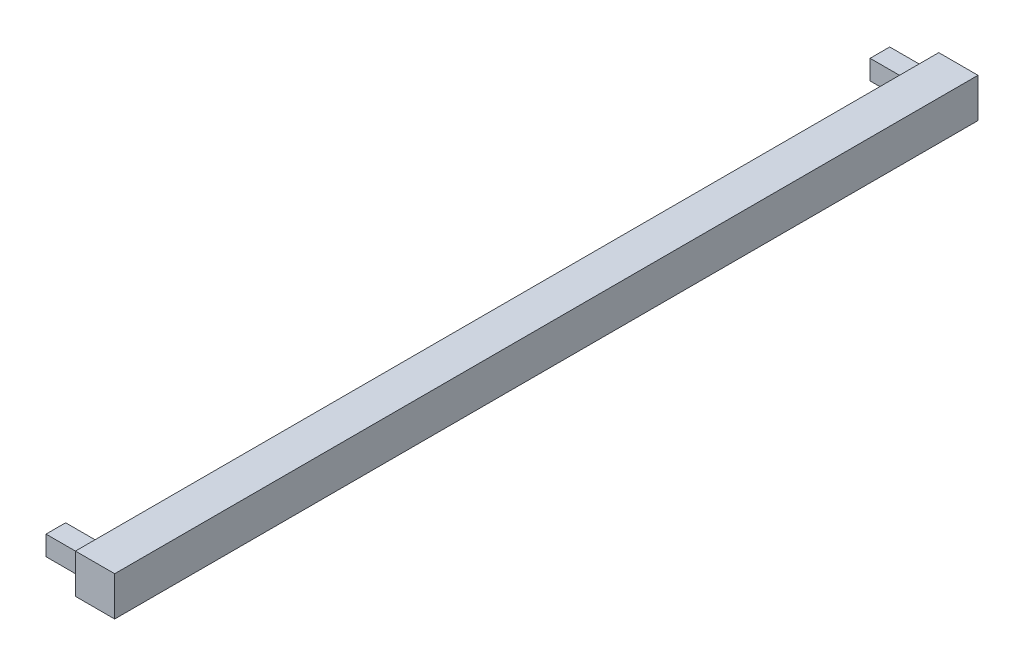
ISO-10303-21;
HEADER;
FILE_DESCRIPTION(('STEP AP214'),'2;1');
FILE_NAME('part.step','',(''),(''),'','','');
FILE_SCHEMA(('AUTOMOTIVE_DESIGN { 1 0 10303 214 1 1 1 1 }'));
ENDSEC;
DATA;
#1=APPLICATION_CONTEXT('core data for automotive mechanical design processes');
#2=APPLICATION_PROTOCOL_DEFINITION('international standard','automotive_design',2000,#1);
#3=PRODUCT_CONTEXT('',#1,'mechanical');
#4=PRODUCT('Part','Part','',(#3));
#5=PRODUCT_RELATED_PRODUCT_CATEGORY('part','',(#4));
#6=PRODUCT_DEFINITION_FORMATION('','',#4);
#7=PRODUCT_DEFINITION_CONTEXT('part definition',#1,'design');
#8=PRODUCT_DEFINITION('design','',#6,#7);
#9=PRODUCT_DEFINITION_SHAPE('','',#8);
#10=(LENGTH_UNIT() NAMED_UNIT(*) SI_UNIT(.MILLI.,.METRE.));
#11=(NAMED_UNIT(*) PLANE_ANGLE_UNIT() SI_UNIT($,.RADIAN.));
#12=(NAMED_UNIT(*) SI_UNIT($,.STERADIAN.) SOLID_ANGLE_UNIT());
#13=UNCERTAINTY_MEASURE_WITH_UNIT(LENGTH_MEASURE(1.E-05),#10,'distance_accuracy_value','');
#14=(GEOMETRIC_REPRESENTATION_CONTEXT(3) GLOBAL_UNCERTAINTY_ASSIGNED_CONTEXT((#13)) GLOBAL_UNIT_ASSIGNED_CONTEXT((#10,
#11,#12)) REPRESENTATION_CONTEXT('',''));
#15=CARTESIAN_POINT('',(0.,0.,0.));
#16=DIRECTION('',(0.,0.,1.));
#17=DIRECTION('',(1.,0.,0.));
#18=AXIS2_PLACEMENT_3D('',#15,#16,#17);
#19=CARTESIAN_POINT('',(0.,0.,110.));
#20=DIRECTION('',(1.,0.,0.));
#21=DIRECTION('',(0.,0.,-1.));
#22=AXIS2_PLACEMENT_3D('',#19,#20,#21);
#23=PLANE('',#22);
#24=DIRECTION('',(0.,-1.,0.));
#25=VECTOR('',#24,1.);
#26=CARTESIAN_POINT('',(0.,1.25,1.25));
#27=LINE('',#26,#25);
#28=CARTESIAN_POINT('',(0.,3.75,1.25));
#29=VERTEX_POINT('',#28);
#30=CARTESIAN_POINT('',(0.,1.25,1.25));
#31=VERTEX_POINT('',#30);
#32=EDGE_CURVE('E142',#29,#31,#27,.T.);
#33=ORIENTED_EDGE('',*,*,#32,.F.);
#34=DIRECTION('',(0.,0.,-1.));
#35=VECTOR('',#34,1.);
#36=CARTESIAN_POINT('',(0.,3.75,1.25));
#37=LINE('',#36,#35);
#38=CARTESIAN_POINT('',(0.,3.75,3.75));
#39=VERTEX_POINT('',#38);
#40=EDGE_CURVE('E155',#39,#29,#37,.T.);
#41=ORIENTED_EDGE('',*,*,#40,.F.);
#42=DIRECTION('',(0.,1.,0.));
#43=VECTOR('',#42,1.);
#44=CARTESIAN_POINT('',(0.,1.25,3.75));
#45=LINE('',#44,#43);
#46=CARTESIAN_POINT('',(0.,1.25,3.75));
#47=VERTEX_POINT('',#46);
#48=EDGE_CURVE('E164',#47,#39,#45,.T.);
#49=ORIENTED_EDGE('',*,*,#48,.F.);
#50=DIRECTION('',(0.,0.,1.));
#51=VECTOR('',#50,1.);
#52=CARTESIAN_POINT('',(0.,1.25,1.25));
#53=LINE('',#52,#51);
#54=EDGE_CURVE('E145',#31,#47,#53,.T.);
#55=ORIENTED_EDGE('',*,*,#54,.F.);
#56=EDGE_LOOP('',(#33,#41,#49,#55));
#57=FACE_BOUND('',#56,.T.);
#58=DIRECTION('',(0.,-1.,0.));
#59=VECTOR('',#58,1.);
#60=CARTESIAN_POINT('',(0.,0.,0.));
#61=LINE('',#60,#59);
#62=CARTESIAN_POINT('',(0.,5.,0.));
#63=VERTEX_POINT('',#62);
#64=CARTESIAN_POINT('',(0.,0.,0.));
#65=VERTEX_POINT('',#64);
#66=EDGE_CURVE('E180',#63,#65,#61,.T.);
#67=ORIENTED_EDGE('',*,*,#66,.T.);
#68=DIRECTION('',(0.,0.,-1.));
#69=VECTOR('',#68,1.);
#70=CARTESIAN_POINT('',(0.,0.,110.));
#71=LINE('',#70,#69);
#72=CARTESIAN_POINT('',(0.,0.,110.));
#73=VERTEX_POINT('',#72);
#74=EDGE_CURVE('E11',#73,#65,#71,.T.);
#75=ORIENTED_EDGE('',*,*,#74,.F.);
#76=DIRECTION('',(0.,-1.,0.));
#77=VECTOR('',#76,1.);
#78=CARTESIAN_POINT('',(0.,0.,110.));
#79=LINE('',#78,#77);
#80=CARTESIAN_POINT('',(0.,5.,110.));
#81=VERTEX_POINT('',#80);
#82=EDGE_CURVE('E181',#81,#73,#79,.T.);
#83=ORIENTED_EDGE('',*,*,#82,.F.);
#84=DIRECTION('',(0.,0.,-1.));
#85=VECTOR('',#84,1.);
#86=CARTESIAN_POINT('',(0.,5.,110.));
#87=LINE('',#86,#85);
#88=EDGE_CURVE('E191',#81,#63,#87,.T.);
#89=ORIENTED_EDGE('',*,*,#88,.T.);
#90=EDGE_LOOP('',(#67,#75,#83,#89));
#91=FACE_BOUND('',#90,.T.);
#92=DIRECTION('',(0.,1.,0.));
#93=VECTOR('',#92,1.);
#94=CARTESIAN_POINT('',(0.,3.75,108.75));
#95=LINE('',#94,#93);
#96=CARTESIAN_POINT('',(0.,1.25,108.75));
#97=VERTEX_POINT('',#96);
#98=CARTESIAN_POINT('',(0.,3.75,108.75));
#99=VERTEX_POINT('',#98);
#100=EDGE_CURVE('E141',#97,#99,#95,.T.);
#101=ORIENTED_EDGE('',*,*,#100,.F.);
#102=DIRECTION('',(0.,0.,1.));
#103=VECTOR('',#102,1.);
#104=CARTESIAN_POINT('',(0.,1.25,108.75));
#105=LINE('',#104,#103);
#106=CARTESIAN_POINT('',(0.,1.25,106.25));
#107=VERTEX_POINT('',#106);
#108=EDGE_CURVE('E138',#107,#97,#105,.T.);
#109=ORIENTED_EDGE('',*,*,#108,.F.);
#110=DIRECTION('',(0.,-1.,0.));
#111=VECTOR('',#110,1.);
#112=CARTESIAN_POINT('',(0.,3.75,106.25));
#113=LINE('',#112,#111);
#114=CARTESIAN_POINT('',(0.,3.75,106.25));
#115=VERTEX_POINT('',#114);
#116=EDGE_CURVE('E52',#115,#107,#113,.T.);
#117=ORIENTED_EDGE('',*,*,#116,.F.);
#118=DIRECTION('',(0.,0.,-1.));
#119=VECTOR('',#118,1.);
#120=CARTESIAN_POINT('',(0.,3.75,108.75));
#121=LINE('',#120,#119);
#122=EDGE_CURVE('E47',#99,#115,#121,.T.);
#123=ORIENTED_EDGE('',*,*,#122,.F.);
#124=EDGE_LOOP('',(#101,#109,#117,#123));
#125=FACE_BOUND('',#124,.T.);
#126=ADVANCED_FACE('F33',(#57,#91,#125),#23,.F.);
#127=CARTESIAN_POINT('',(0.,0.,110.));
#128=DIRECTION('',(0.,1.,0.));
#129=DIRECTION('',(0.,0.,1.));
#130=AXIS2_PLACEMENT_3D('',#127,#128,#129);
#131=PLANE('',#130);
#132=DIRECTION('',(1.,0.,0.));
#133=VECTOR('',#132,1.);
#134=CARTESIAN_POINT('',(0.,0.,0.));
#135=LINE('',#134,#133);
#136=CARTESIAN_POINT('',(5.,0.,0.));
#137=VERTEX_POINT('',#136);
#138=EDGE_CURVE('E194',#65,#137,#135,.T.);
#139=ORIENTED_EDGE('',*,*,#138,.T.);
#140=DIRECTION('',(0.,0.,-1.));
#141=VECTOR('',#140,1.);
#142=CARTESIAN_POINT('',(5.,0.,110.));
#143=LINE('',#142,#141);
#144=CARTESIAN_POINT('',(5.,0.,110.));
#145=VERTEX_POINT('',#144);
#146=EDGE_CURVE('E40',#145,#137,#143,.T.);
#147=ORIENTED_EDGE('',*,*,#146,.F.);
#148=DIRECTION('',(1.,0.,0.));
#149=VECTOR('',#148,1.);
#150=CARTESIAN_POINT('',(0.,0.,110.));
#151=LINE('',#150,#149);
#152=EDGE_CURVE('E184',#73,#145,#151,.T.);
#153=ORIENTED_EDGE('',*,*,#152,.F.);
#154=ORIENTED_EDGE('',*,*,#74,.T.);
#155=EDGE_LOOP('',(#139,#147,#153,#154));
#156=FACE_BOUND('',#155,.T.);
#157=ADVANCED_FACE('F224',(#156),#131,.F.);
#158=CARTESIAN_POINT('',(5.,0.,110.));
#159=DIRECTION('',(-1.,0.,0.));
#160=DIRECTION('',(0.,0.,1.));
#161=AXIS2_PLACEMENT_3D('',#158,#159,#160);
#162=PLANE('',#161);
#163=DIRECTION('',(0.,1.,0.));
#164=VECTOR('',#163,1.);
#165=CARTESIAN_POINT('',(5.,0.,0.));
#166=LINE('',#165,#164);
#167=CARTESIAN_POINT('',(5.,5.,0.));
#168=VERTEX_POINT('',#167);
#169=EDGE_CURVE('E196',#137,#168,#166,.T.);
#170=ORIENTED_EDGE('',*,*,#169,.T.);
#171=DIRECTION('',(0.,0.,-1.));
#172=VECTOR('',#171,1.);
#173=CARTESIAN_POINT('',(5.,5.,110.));
#174=LINE('',#173,#172);
#175=CARTESIAN_POINT('',(5.,5.,110.));
#176=VERTEX_POINT('',#175);
#177=EDGE_CURVE('E201',#176,#168,#174,.T.);
#178=ORIENTED_EDGE('',*,*,#177,.F.);
#179=DIRECTION('',(0.,1.,0.));
#180=VECTOR('',#179,1.);
#181=CARTESIAN_POINT('',(5.,0.,110.));
#182=LINE('',#181,#180);
#183=EDGE_CURVE('E187',#145,#176,#182,.T.);
#184=ORIENTED_EDGE('',*,*,#183,.F.);
#185=ORIENTED_EDGE('',*,*,#146,.T.);
#186=EDGE_LOOP('',(#170,#178,#184,#185));
#187=FACE_BOUND('',#186,.T.);
#188=ADVANCED_FACE('F208',(#187),#162,.F.);
#189=CARTESIAN_POINT('',(0.,5.,110.));
#190=DIRECTION('',(0.,-1.,0.));
#191=DIRECTION('',(0.,0.,-1.));
#192=AXIS2_PLACEMENT_3D('',#189,#190,#191);
#193=PLANE('',#192);
#194=DIRECTION('',(-1.,0.,0.));
#195=VECTOR('',#194,1.);
#196=CARTESIAN_POINT('',(0.,5.,0.));
#197=LINE('',#196,#195);
#198=EDGE_CURVE('E185',#168,#63,#197,.T.);
#199=ORIENTED_EDGE('',*,*,#198,.T.);
#200=ORIENTED_EDGE('',*,*,#88,.F.);
#201=DIRECTION('',(-1.,0.,0.));
#202=VECTOR('',#201,1.);
#203=CARTESIAN_POINT('',(0.,5.,110.));
#204=LINE('',#203,#202);
#205=EDGE_CURVE('E189',#176,#81,#204,.T.);
#206=ORIENTED_EDGE('',*,*,#205,.F.);
#207=ORIENTED_EDGE('',*,*,#177,.T.);
#208=EDGE_LOOP('',(#199,#200,#206,#207));
#209=FACE_BOUND('',#208,.T.);
#210=ADVANCED_FACE('F217',(#209),#193,.F.);
#211=CARTESIAN_POINT('',(0.,0.,110.));
#212=DIRECTION('',(0.,0.,-1.));
#213=DIRECTION('',(-1.,0.,0.));
#214=AXIS2_PLACEMENT_3D('',#211,#212,#213);
#215=PLANE('',#214);
#216=ORIENTED_EDGE('',*,*,#82,.T.);
#217=ORIENTED_EDGE('',*,*,#152,.T.);
#218=ORIENTED_EDGE('',*,*,#183,.T.);
#219=ORIENTED_EDGE('',*,*,#205,.T.);
#220=EDGE_LOOP('',(#216,#217,#218,#219));
#221=FACE_BOUND('',#220,.T.);
#222=ADVANCED_FACE('F223',(#221),#215,.F.);
#223=CARTESIAN_POINT('',(0.,0.,0.));
#224=DIRECTION('',(0.,0.,-1.));
#225=DIRECTION('',(-1.,0.,0.));
#226=AXIS2_PLACEMENT_3D('',#223,#224,#225);
#227=PLANE('',#226);
#228=ORIENTED_EDGE('',*,*,#66,.F.);
#229=ORIENTED_EDGE('',*,*,#198,.F.);
#230=ORIENTED_EDGE('',*,*,#169,.F.);
#231=ORIENTED_EDGE('',*,*,#138,.F.);
#232=EDGE_LOOP('',(#228,#229,#230,#231));
#233=FACE_BOUND('',#232,.T.);
#234=ADVANCED_FACE('F214',(#233),#227,.T.);
#235=CARTESIAN_POINT('',(-5.,1.25,1.25));
#236=DIRECTION('',(0.,0.,1.));
#237=DIRECTION('',(1.,0.,0.));
#238=AXIS2_PLACEMENT_3D('',#235,#236,#237);
#239=PLANE('',#238);
#240=ORIENTED_EDGE('',*,*,#32,.T.);
#241=DIRECTION('',(1.,0.,0.));
#242=VECTOR('',#241,1.);
#243=CARTESIAN_POINT('',(-5.,1.25,1.25));
#244=LINE('',#243,#242);
#245=CARTESIAN_POINT('',(-5.,1.25,1.25));
#246=VERTEX_POINT('',#245);
#247=EDGE_CURVE('E177',#246,#31,#244,.T.);
#248=ORIENTED_EDGE('',*,*,#247,.F.);
#249=DIRECTION('',(0.,-1.,0.));
#250=VECTOR('',#249,1.);
#251=CARTESIAN_POINT('',(-5.,1.25,1.25));
#252=LINE('',#251,#250);
#253=CARTESIAN_POINT('',(-5.,3.75,1.25));
#254=VERTEX_POINT('',#253);
#255=EDGE_CURVE('E151',#254,#246,#252,.T.);
#256=ORIENTED_EDGE('',*,*,#255,.F.);
#257=DIRECTION('',(1.,0.,0.));
#258=VECTOR('',#257,1.);
#259=CARTESIAN_POINT('',(-5.,3.75,1.25));
#260=LINE('',#259,#258);
#261=EDGE_CURVE('E160',#254,#29,#260,.T.);
#262=ORIENTED_EDGE('',*,*,#261,.T.);
#263=EDGE_LOOP('',(#240,#248,#256,#262));
#264=FACE_BOUND('',#263,.T.);
#265=ADVANCED_FACE('F237',(#264),#239,.F.);
#266=CARTESIAN_POINT('',(-5.,1.25,1.25));
#267=DIRECTION('',(0.,1.,0.));
#268=DIRECTION('',(0.,0.,1.));
#269=AXIS2_PLACEMENT_3D('',#266,#267,#268);
#270=PLANE('',#269);
#271=ORIENTED_EDGE('',*,*,#54,.T.);
#272=DIRECTION('',(1.,0.,0.));
#273=VECTOR('',#272,1.);
#274=CARTESIAN_POINT('',(-5.,1.25,3.75));
#275=LINE('',#274,#273);
#276=CARTESIAN_POINT('',(-5.,1.25,3.75));
#277=VERTEX_POINT('',#276);
#278=EDGE_CURVE('E174',#277,#47,#275,.T.);
#279=ORIENTED_EDGE('',*,*,#278,.F.);
#280=DIRECTION('',(0.,0.,1.));
#281=VECTOR('',#280,1.);
#282=CARTESIAN_POINT('',(-5.,1.25,1.25));
#283=LINE('',#282,#281);
#284=EDGE_CURVE('E154',#246,#277,#283,.T.);
#285=ORIENTED_EDGE('',*,*,#284,.F.);
#286=ORIENTED_EDGE('',*,*,#247,.T.);
#287=EDGE_LOOP('',(#271,#279,#285,#286));
#288=FACE_BOUND('',#287,.T.);
#289=ADVANCED_FACE('F242',(#288),#270,.F.);
#290=CARTESIAN_POINT('',(-5.,1.25,3.75));
#291=DIRECTION('',(0.,0.,-1.));
#292=DIRECTION('',(-1.,0.,0.));
#293=AXIS2_PLACEMENT_3D('',#290,#291,#292);
#294=PLANE('',#293);
#295=ORIENTED_EDGE('',*,*,#48,.T.);
#296=DIRECTION('',(1.,0.,0.));
#297=VECTOR('',#296,1.);
#298=CARTESIAN_POINT('',(-5.,3.75,3.75));
#299=LINE('',#298,#297);
#300=CARTESIAN_POINT('',(-5.,3.75,3.75));
#301=VERTEX_POINT('',#300);
#302=EDGE_CURVE('E171',#301,#39,#299,.T.);
#303=ORIENTED_EDGE('',*,*,#302,.F.);
#304=DIRECTION('',(0.,1.,0.));
#305=VECTOR('',#304,1.);
#306=CARTESIAN_POINT('',(-5.,1.25,3.75));
#307=LINE('',#306,#305);
#308=EDGE_CURVE('E157',#277,#301,#307,.T.);
#309=ORIENTED_EDGE('',*,*,#308,.F.);
#310=ORIENTED_EDGE('',*,*,#278,.T.);
#311=EDGE_LOOP('',(#295,#303,#309,#310));
#312=FACE_BOUND('',#311,.T.);
#313=ADVANCED_FACE('F246',(#312),#294,.F.);
#314=CARTESIAN_POINT('',(-5.,3.75,1.25));
#315=DIRECTION('',(0.,-1.,0.));
#316=DIRECTION('',(0.,0.,-1.));
#317=AXIS2_PLACEMENT_3D('',#314,#315,#316);
#318=PLANE('',#317);
#319=ORIENTED_EDGE('',*,*,#40,.T.);
#320=ORIENTED_EDGE('',*,*,#261,.F.);
#321=DIRECTION('',(0.,0.,-1.));
#322=VECTOR('',#321,1.);
#323=CARTESIAN_POINT('',(-5.,3.75,1.25));
#324=LINE('',#323,#322);
#325=EDGE_CURVE('E159',#301,#254,#324,.T.);
#326=ORIENTED_EDGE('',*,*,#325,.F.);
#327=ORIENTED_EDGE('',*,*,#302,.T.);
#328=EDGE_LOOP('',(#319,#320,#326,#327));
#329=FACE_BOUND('',#328,.T.);
#330=ADVANCED_FACE('F250',(#329),#318,.F.);
#331=CARTESIAN_POINT('',(-5.,0.,0.));
#332=DIRECTION('',(1.,0.,0.));
#333=DIRECTION('',(0.,0.,-1.));
#334=AXIS2_PLACEMENT_3D('',#331,#332,#333);
#335=PLANE('',#334);
#336=ORIENTED_EDGE('',*,*,#255,.T.);
#337=ORIENTED_EDGE('',*,*,#284,.T.);
#338=ORIENTED_EDGE('',*,*,#308,.T.);
#339=ORIENTED_EDGE('',*,*,#325,.T.);
#340=EDGE_LOOP('',(#336,#337,#338,#339));
#341=FACE_BOUND('',#340,.T.);
#342=ADVANCED_FACE('F254',(#341),#335,.F.);
#343=CARTESIAN_POINT('',(-5.,3.75,108.75));
#344=DIRECTION('',(0.,0.,-1.));
#345=DIRECTION('',(-1.,0.,0.));
#346=AXIS2_PLACEMENT_3D('',#343,#344,#345);
#347=PLANE('',#346);
#348=ORIENTED_EDGE('',*,*,#100,.T.);
#349=DIRECTION('',(1.,0.,0.));
#350=VECTOR('',#349,1.);
#351=CARTESIAN_POINT('',(-5.,3.75,108.75));
#352=LINE('',#351,#350);
#353=CARTESIAN_POINT('',(-5.,3.75,108.75));
#354=VERTEX_POINT('',#353);
#355=EDGE_CURVE('E122',#354,#99,#352,.T.);
#356=ORIENTED_EDGE('',*,*,#355,.F.);
#357=DIRECTION('',(0.,1.,0.));
#358=VECTOR('',#357,1.);
#359=CARTESIAN_POINT('',(-5.,3.75,108.75));
#360=LINE('',#359,#358);
#361=CARTESIAN_POINT('',(-5.,1.25,108.75));
#362=VERTEX_POINT('',#361);
#363=EDGE_CURVE('E129',#362,#354,#360,.T.);
#364=ORIENTED_EDGE('',*,*,#363,.F.);
#365=DIRECTION('',(1.,0.,0.));
#366=VECTOR('',#365,1.);
#367=CARTESIAN_POINT('',(-5.,1.25,108.75));
#368=LINE('',#367,#366);
#369=EDGE_CURVE('E368',#362,#97,#368,.T.);
#370=ORIENTED_EDGE('',*,*,#369,.T.);
#371=EDGE_LOOP('',(#348,#356,#364,#370));
#372=FACE_BOUND('',#371,.T.);
#373=ADVANCED_FACE('F140',(#372),#347,.F.);
#374=CARTESIAN_POINT('',(-5.,3.75,108.75));
#375=DIRECTION('',(0.,-1.,0.));
#376=DIRECTION('',(0.,0.,-1.));
#377=AXIS2_PLACEMENT_3D('',#374,#375,#376);
#378=PLANE('',#377);
#379=ORIENTED_EDGE('',*,*,#122,.T.);
#380=DIRECTION('',(1.,0.,0.));
#381=VECTOR('',#380,1.);
#382=CARTESIAN_POINT('',(-5.,3.75,106.25));
#383=LINE('',#382,#381);
#384=CARTESIAN_POINT('',(-5.,3.75,106.25));
#385=VERTEX_POINT('',#384);
#386=EDGE_CURVE('E125',#385,#115,#383,.T.);
#387=ORIENTED_EDGE('',*,*,#386,.F.);
#388=DIRECTION('',(0.,0.,-1.));
#389=VECTOR('',#388,1.);
#390=CARTESIAN_POINT('',(-5.,3.75,108.75));
#391=LINE('',#390,#389);
#392=EDGE_CURVE('E118',#354,#385,#391,.T.);
#393=ORIENTED_EDGE('',*,*,#392,.F.);
#394=ORIENTED_EDGE('',*,*,#355,.T.);
#395=EDGE_LOOP('',(#379,#387,#393,#394));
#396=FACE_BOUND('',#395,.T.);
#397=ADVANCED_FACE('F120',(#396),#378,.F.);
#398=CARTESIAN_POINT('',(-5.,3.75,106.25));
#399=DIRECTION('',(0.,0.,1.));
#400=DIRECTION('',(1.,0.,0.));
#401=AXIS2_PLACEMENT_3D('',#398,#399,#400);
#402=PLANE('',#401);
#403=ORIENTED_EDGE('',*,*,#116,.T.);
#404=DIRECTION('',(1.,0.,0.));
#405=VECTOR('',#404,1.);
#406=CARTESIAN_POINT('',(-5.,1.25,106.25));
#407=LINE('',#406,#405);
#408=CARTESIAN_POINT('',(-5.,1.25,106.25));
#409=VERTEX_POINT('',#408);
#410=EDGE_CURVE('E147',#409,#107,#407,.T.);
#411=ORIENTED_EDGE('',*,*,#410,.F.);
#412=DIRECTION('',(0.,-1.,0.));
#413=VECTOR('',#412,1.);
#414=CARTESIAN_POINT('',(-5.,3.75,106.25));
#415=LINE('',#414,#413);
#416=EDGE_CURVE('E128',#385,#409,#415,.T.);
#417=ORIENTED_EDGE('',*,*,#416,.F.);
#418=ORIENTED_EDGE('',*,*,#386,.T.);
#419=EDGE_LOOP('',(#403,#411,#417,#418));
#420=FACE_BOUND('',#419,.T.);
#421=ADVANCED_FACE('F263',(#420),#402,.F.);
#422=CARTESIAN_POINT('',(-5.,1.25,108.75));
#423=DIRECTION('',(0.,1.,0.));
#424=DIRECTION('',(0.,0.,1.));
#425=AXIS2_PLACEMENT_3D('',#422,#423,#424);
#426=PLANE('',#425);
#427=ORIENTED_EDGE('',*,*,#108,.T.);
#428=ORIENTED_EDGE('',*,*,#369,.F.);
#429=DIRECTION('',(0.,0.,1.));
#430=VECTOR('',#429,1.);
#431=CARTESIAN_POINT('',(-5.,1.25,108.75));
#432=LINE('',#431,#430);
#433=EDGE_CURVE('E134',#409,#362,#432,.T.);
#434=ORIENTED_EDGE('',*,*,#433,.F.);
#435=ORIENTED_EDGE('',*,*,#410,.T.);
#436=EDGE_LOOP('',(#427,#428,#434,#435));
#437=FACE_BOUND('',#436,.T.);
#438=ADVANCED_FACE('F266',(#437),#426,.F.);
#439=CARTESIAN_POINT('',(-5.,0.,0.));
#440=DIRECTION('',(1.,0.,0.));
#441=DIRECTION('',(0.,0.,-1.));
#442=AXIS2_PLACEMENT_3D('',#439,#440,#441);
#443=PLANE('',#442);
#444=ORIENTED_EDGE('',*,*,#363,.T.);
#445=ORIENTED_EDGE('',*,*,#392,.T.);
#446=ORIENTED_EDGE('',*,*,#416,.T.);
#447=ORIENTED_EDGE('',*,*,#433,.T.);
#448=EDGE_LOOP('',(#444,#445,#446,#447));
#449=FACE_BOUND('',#448,.T.);
#450=ADVANCED_FACE('F132',(#449),#443,.F.);
#451=CLOSED_SHELL('',(#126,#157,#188,#210,#222,#234,#265,#289,#313,#330,#342,#373,#397,#421,
#438,#450));
#452=MANIFOLD_SOLID_BREP('B2',#451);
#453=ADVANCED_BREP_SHAPE_REPRESENTATION('',(#18,#452),#14);
#454=SHAPE_DEFINITION_REPRESENTATION(#9,#453);
ENDSEC;
END-ISO-10303-21;
